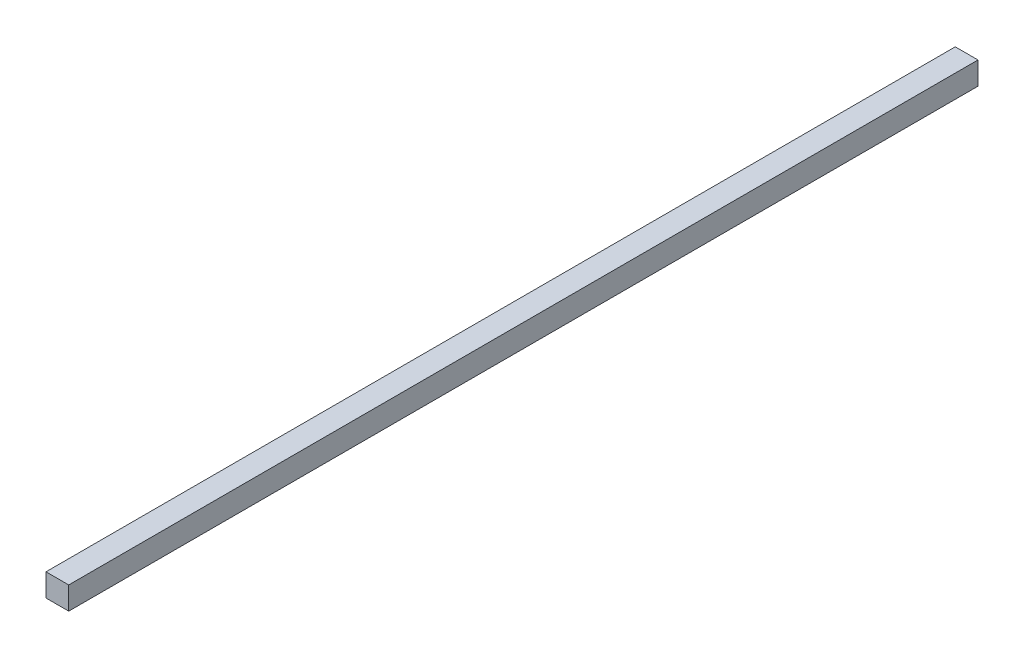
ISO-10303-21;
HEADER;
FILE_DESCRIPTION(('STEP AP214'),'2;1');
FILE_NAME('part.step','',(''),(''),'','','');
FILE_SCHEMA(('AUTOMOTIVE_DESIGN { 1 0 10303 214 1 1 1 1 }'));
ENDSEC;
DATA;
#1=APPLICATION_CONTEXT('core data for automotive mechanical design processes');
#2=APPLICATION_PROTOCOL_DEFINITION('international standard','automotive_design',2000,#1);
#3=PRODUCT_CONTEXT('',#1,'mechanical');
#4=PRODUCT('Part','Part','',(#3));
#5=PRODUCT_RELATED_PRODUCT_CATEGORY('part','',(#4));
#6=PRODUCT_DEFINITION_FORMATION('','',#4);
#7=PRODUCT_DEFINITION_CONTEXT('part definition',#1,'design');
#8=PRODUCT_DEFINITION('design','',#6,#7);
#9=PRODUCT_DEFINITION_SHAPE('','',#8);
#10=(LENGTH_UNIT() NAMED_UNIT(*) SI_UNIT(.MILLI.,.METRE.));
#11=(NAMED_UNIT(*) PLANE_ANGLE_UNIT() SI_UNIT($,.RADIAN.));
#12=(NAMED_UNIT(*) SI_UNIT($,.STERADIAN.) SOLID_ANGLE_UNIT());
#13=UNCERTAINTY_MEASURE_WITH_UNIT(LENGTH_MEASURE(1.E-05),#10,'distance_accuracy_value','');
#14=(GEOMETRIC_REPRESENTATION_CONTEXT(3) GLOBAL_UNCERTAINTY_ASSIGNED_CONTEXT((#13)) GLOBAL_UNIT_ASSIGNED_CONTEXT((#10,
#11,#12)) REPRESENTATION_CONTEXT('',''));
#15=CARTESIAN_POINT('',(0.,0.,0.));
#16=DIRECTION('',(0.,0.,1.));
#17=DIRECTION('',(1.,0.,0.));
#18=AXIS2_PLACEMENT_3D('',#15,#16,#17);
#19=CARTESIAN_POINT('',(0.,0.,1016.));
#20=DIRECTION('',(1.,0.,0.));
#21=DIRECTION('',(0.,1.,0.));
#22=AXIS2_PLACEMENT_3D('',#19,#20,#21);
#23=PLANE('',#22);
#24=DIRECTION('',(0.,-1.,0.));
#25=VECTOR('',#24,1.);
#26=CARTESIAN_POINT('',(0.,0.,0.));
#27=LINE('',#26,#25);
#28=CARTESIAN_POINT('',(0.,25.4,0.));
#29=VERTEX_POINT('',#28);
#30=CARTESIAN_POINT('',(0.,0.,0.));
#31=VERTEX_POINT('',#30);
#32=EDGE_CURVE('E99',#29,#31,#27,.T.);
#33=ORIENTED_EDGE('',*,*,#32,.T.);
#34=DIRECTION('',(0.,0.,-1.));
#35=VECTOR('',#34,1.);
#36=CARTESIAN_POINT('',(0.,0.,1016.));
#37=LINE('',#36,#35);
#38=CARTESIAN_POINT('',(0.,0.,1016.));
#39=VERTEX_POINT('',#38);
#40=EDGE_CURVE('E11',#39,#31,#37,.T.);
#41=ORIENTED_EDGE('',*,*,#40,.F.);
#42=DIRECTION('',(0.,-1.,0.));
#43=VECTOR('',#42,1.);
#44=CARTESIAN_POINT('',(0.,0.,1016.));
#45=LINE('',#44,#43);
#46=CARTESIAN_POINT('',(0.,25.4,1016.));
#47=VERTEX_POINT('',#46);
#48=EDGE_CURVE('E87',#47,#39,#45,.T.);
#49=ORIENTED_EDGE('',*,*,#48,.F.);
#50=DIRECTION('',(0.,0.,-1.));
#51=VECTOR('',#50,1.);
#52=CARTESIAN_POINT('',(0.,25.4,1016.));
#53=LINE('',#52,#51);
#54=EDGE_CURVE('E95',#47,#29,#53,.T.);
#55=ORIENTED_EDGE('',*,*,#54,.T.);
#56=EDGE_LOOP('',(#33,#41,#49,#55));
#57=FACE_BOUND('',#56,.T.);
#58=ADVANCED_FACE('F36',(#57),#23,.F.);
#59=CARTESIAN_POINT('',(0.,0.,1016.));
#60=DIRECTION('',(0.,1.,0.));
#61=DIRECTION('',(0.,0.,1.));
#62=AXIS2_PLACEMENT_3D('',#59,#60,#61);
#63=PLANE('',#62);
#64=DIRECTION('',(1.,0.,0.));
#65=VECTOR('',#64,1.);
#66=CARTESIAN_POINT('',(0.,0.,0.));
#67=LINE('',#66,#65);
#68=CARTESIAN_POINT('',(25.4,0.,0.));
#69=VERTEX_POINT('',#68);
#70=EDGE_CURVE('E91',#31,#69,#67,.T.);
#71=ORIENTED_EDGE('',*,*,#70,.T.);
#72=DIRECTION('',(0.,0.,-1.));
#73=VECTOR('',#72,1.);
#74=CARTESIAN_POINT('',(25.4,0.,1016.));
#75=LINE('',#74,#73);
#76=CARTESIAN_POINT('',(25.4,0.,1016.));
#77=VERTEX_POINT('',#76);
#78=EDGE_CURVE('E44',#77,#69,#75,.T.);
#79=ORIENTED_EDGE('',*,*,#78,.F.);
#80=DIRECTION('',(1.,0.,0.));
#81=VECTOR('',#80,1.);
#82=CARTESIAN_POINT('',(0.,0.,1016.));
#83=LINE('',#82,#81);
#84=EDGE_CURVE('E82',#39,#77,#83,.T.);
#85=ORIENTED_EDGE('',*,*,#84,.F.);
#86=ORIENTED_EDGE('',*,*,#40,.T.);
#87=EDGE_LOOP('',(#71,#79,#85,#86));
#88=FACE_BOUND('',#87,.T.);
#89=ADVANCED_FACE('F90',(#88),#63,.F.);
#90=CARTESIAN_POINT('',(25.4,0.,1016.));
#91=DIRECTION('',(-1.,0.,0.));
#92=DIRECTION('',(0.,-1.,0.));
#93=AXIS2_PLACEMENT_3D('',#90,#91,#92);
#94=PLANE('',#93);
#95=DIRECTION('',(0.,1.,0.));
#96=VECTOR('',#95,1.);
#97=CARTESIAN_POINT('',(25.4,0.,0.));
#98=LINE('',#97,#96);
#99=CARTESIAN_POINT('',(25.4,25.4,0.));
#100=VERTEX_POINT('',#99);
#101=EDGE_CURVE('E69',#69,#100,#98,.T.);
#102=ORIENTED_EDGE('',*,*,#101,.T.);
#103=DIRECTION('',(0.,0.,-1.));
#104=VECTOR('',#103,1.);
#105=CARTESIAN_POINT('',(25.4,25.4,1016.));
#106=LINE('',#105,#104);
#107=CARTESIAN_POINT('',(25.4,25.4,1016.));
#108=VERTEX_POINT('',#107);
#109=EDGE_CURVE('E92',#108,#100,#106,.T.);
#110=ORIENTED_EDGE('',*,*,#109,.F.);
#111=DIRECTION('',(0.,1.,0.));
#112=VECTOR('',#111,1.);
#113=CARTESIAN_POINT('',(25.4,0.,1016.));
#114=LINE('',#113,#112);
#115=EDGE_CURVE('E85',#77,#108,#114,.T.);
#116=ORIENTED_EDGE('',*,*,#115,.F.);
#117=ORIENTED_EDGE('',*,*,#78,.T.);
#118=EDGE_LOOP('',(#102,#110,#116,#117));
#119=FACE_BOUND('',#118,.T.);
#120=ADVANCED_FACE('F93',(#119),#94,.F.);
#121=CARTESIAN_POINT('',(0.,25.4,1016.));
#122=DIRECTION('',(0.,-1.,0.));
#123=DIRECTION('',(0.,0.,-1.));
#124=AXIS2_PLACEMENT_3D('',#121,#122,#123);
#125=PLANE('',#124);
#126=DIRECTION('',(-1.,0.,0.));
#127=VECTOR('',#126,1.);
#128=CARTESIAN_POINT('',(0.,25.4,0.));
#129=LINE('',#128,#127);
#130=EDGE_CURVE('E75',#100,#29,#129,.T.);
#131=ORIENTED_EDGE('',*,*,#130,.T.);
#132=ORIENTED_EDGE('',*,*,#54,.F.);
#133=DIRECTION('',(-1.,0.,0.));
#134=VECTOR('',#133,1.);
#135=CARTESIAN_POINT('',(0.,25.4,1016.));
#136=LINE('',#135,#134);
#137=EDGE_CURVE('E52',#108,#47,#136,.T.);
#138=ORIENTED_EDGE('',*,*,#137,.F.);
#139=ORIENTED_EDGE('',*,*,#109,.T.);
#140=EDGE_LOOP('',(#131,#132,#138,#139));
#141=FACE_BOUND('',#140,.T.);
#142=ADVANCED_FACE('F106',(#141),#125,.F.);
#143=CARTESIAN_POINT('',(0.,0.,1016.));
#144=DIRECTION('',(0.,0.,-1.));
#145=DIRECTION('',(-1.,0.,0.));
#146=AXIS2_PLACEMENT_3D('',#143,#144,#145);
#147=PLANE('',#146);
#148=ORIENTED_EDGE('',*,*,#48,.T.);
#149=ORIENTED_EDGE('',*,*,#84,.T.);
#150=ORIENTED_EDGE('',*,*,#115,.T.);
#151=ORIENTED_EDGE('',*,*,#137,.T.);
#152=EDGE_LOOP('',(#148,#149,#150,#151));
#153=FACE_BOUND('',#152,.T.);
#154=ADVANCED_FACE('F83',(#153),#147,.F.);
#155=CARTESIAN_POINT('',(0.,0.,0.));
#156=DIRECTION('',(0.,0.,-1.));
#157=DIRECTION('',(-1.,0.,0.));
#158=AXIS2_PLACEMENT_3D('',#155,#156,#157);
#159=PLANE('',#158);
#160=ORIENTED_EDGE('',*,*,#32,.F.);
#161=ORIENTED_EDGE('',*,*,#130,.F.);
#162=ORIENTED_EDGE('',*,*,#101,.F.);
#163=ORIENTED_EDGE('',*,*,#70,.F.);
#164=EDGE_LOOP('',(#160,#161,#162,#163));
#165=FACE_BOUND('',#164,.T.);
#166=ADVANCED_FACE('F109',(#165),#159,.T.);
#167=CLOSED_SHELL('',(#58,#89,#120,#142,#154,#166));
#168=MANIFOLD_SOLID_BREP('B2',#167);
#169=ADVANCED_BREP_SHAPE_REPRESENTATION('',(#18,#168),#14);
#170=SHAPE_DEFINITION_REPRESENTATION(#9,#169);
ENDSEC;
END-ISO-10303-21;
